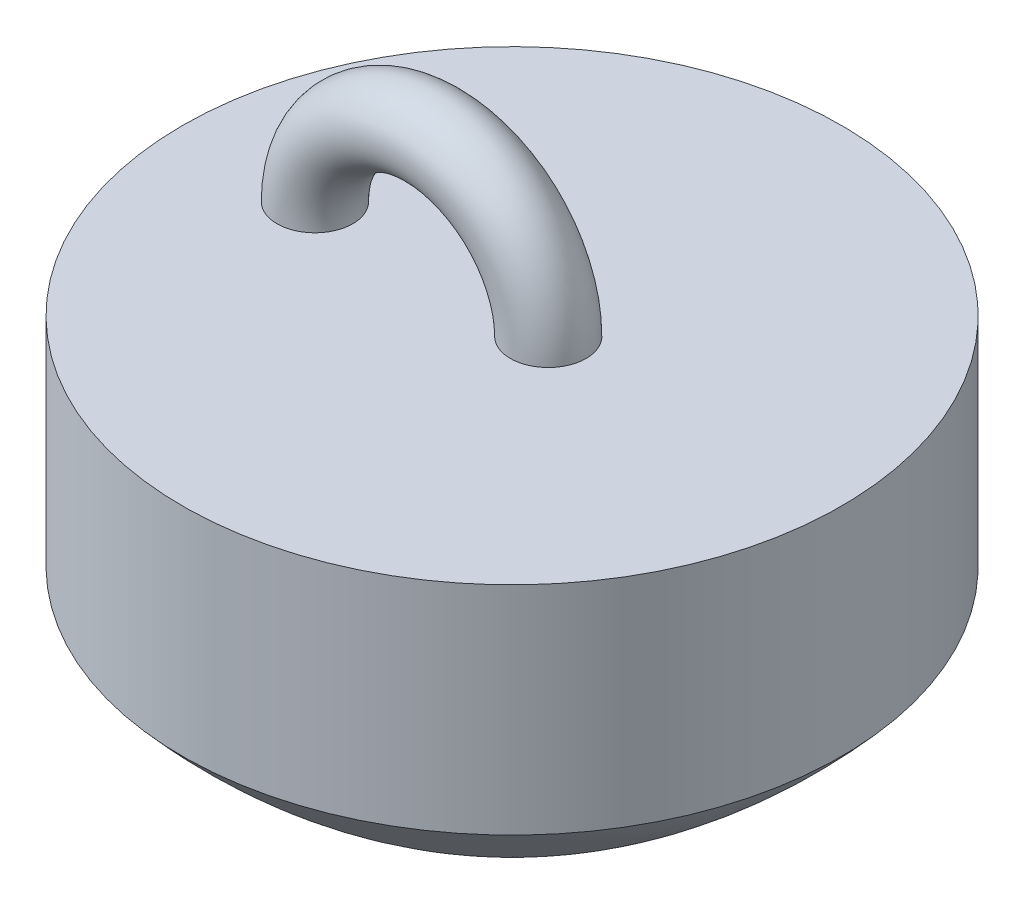
ISO-10303-21;
HEADER;
FILE_DESCRIPTION(('STEP AP214'),'2;1');
FILE_NAME('part.step','',(''),(''),'','','');
FILE_SCHEMA(('AUTOMOTIVE_DESIGN { 1 0 10303 214 1 1 1 1 }'));
ENDSEC;
DATA;
#1=APPLICATION_CONTEXT('core data for automotive mechanical design processes');
#2=APPLICATION_PROTOCOL_DEFINITION('international standard','automotive_design',2000,#1);
#3=PRODUCT_CONTEXT('',#1,'mechanical');
#4=PRODUCT('Part','Part','',(#3));
#5=PRODUCT_RELATED_PRODUCT_CATEGORY('part','',(#4));
#6=PRODUCT_DEFINITION_FORMATION('','',#4);
#7=PRODUCT_DEFINITION_CONTEXT('part definition',#1,'design');
#8=PRODUCT_DEFINITION('design','',#6,#7);
#9=PRODUCT_DEFINITION_SHAPE('','',#8);
#10=(LENGTH_UNIT() NAMED_UNIT(*) SI_UNIT(.MILLI.,.METRE.));
#11=(NAMED_UNIT(*) PLANE_ANGLE_UNIT() SI_UNIT($,.RADIAN.));
#12=(NAMED_UNIT(*) SI_UNIT($,.STERADIAN.) SOLID_ANGLE_UNIT());
#13=UNCERTAINTY_MEASURE_WITH_UNIT(LENGTH_MEASURE(1.E-05),#10,'distance_accuracy_value','');
#14=(GEOMETRIC_REPRESENTATION_CONTEXT(3) GLOBAL_UNCERTAINTY_ASSIGNED_CONTEXT((#13)) GLOBAL_UNIT_ASSIGNED_CONTEXT((#10,
#11,#12)) REPRESENTATION_CONTEXT('',''));
#15=CARTESIAN_POINT('',(0.,0.,0.));
#16=DIRECTION('',(0.,0.,1.));
#17=DIRECTION('',(1.,0.,0.));
#18=AXIS2_PLACEMENT_3D('',#15,#16,#17);
#19=CARTESIAN_POINT('',(14.605,-9.08621613082581,0.));
#20=DIRECTION('',(0.,1.,0.));
#21=DIRECTION('',(-1.,0.,0.));
#22=AXIS2_PLACEMENT_3D('',#19,#20,#21);
#23=CYLINDRICAL_SURFACE('',#22,14.351);
#24=CARTESIAN_POINT('',(14.605,-18.5247713191279,0.));
#25=DIRECTION('',(0.,1.,0.));
#26=DIRECTION('',(-1.,0.,0.));
#27=AXIS2_PLACEMENT_3D('',#24,#25,#26);
#28=CIRCLE('',#27,14.351);
#29=CARTESIAN_POINT('',(0.254000000000001,-18.5247713191279,0.));
#30=VERTEX_POINT('',#29);
#31=EDGE_CURVE('E11',#30,#30,#28,.T.);
#32=ORIENTED_EDGE('',*,*,#31,.T.);
#33=EDGE_LOOP('',(#32));
#34=FACE_BOUND('',#33,.T.);
#35=CARTESIAN_POINT('',(14.605,-9.08621613082581,0.));
#36=DIRECTION('',(0.,1.,0.));
#37=DIRECTION('',(-1.,0.,0.));
#38=AXIS2_PLACEMENT_3D('',#35,#36,#37);
#39=CIRCLE('',#38,14.351);
#40=CARTESIAN_POINT('',(0.254000000000001,-9.08621613082581,0.));
#41=VERTEX_POINT('',#40);
#42=EDGE_CURVE('E54',#41,#41,#39,.T.);
#43=ORIENTED_EDGE('',*,*,#42,.F.);
#44=EDGE_LOOP('',(#43));
#45=FACE_BOUND('',#44,.T.);
#46=ADVANCED_FACE('F47',(#34,#45),#23,.T.);
#47=CARTESIAN_POINT('',(18.9030515195273,-2.18658188447792,0.));
#48=DIRECTION('',(0.,0.,-1.));
#49=DIRECTION('',(-1.,0.,0.));
#50=AXIS2_PLACEMENT_3D('',#47,#48,#49);
#51=CIRCLE('',#50,24.7936192715079);
#52=TRIMMED_CURVE('',#51,(PARAMETER_VALUE(-1.3965629923342)),(PARAMETER_VALUE(1.3965629923342)),
.T.,.PARAMETER.);
#53=CARTESIAN_POINT('',(14.605,-2.18658188447792,0.));
#54=DIRECTION('',(0.,1.,0.));
#55=AXIS1_PLACEMENT('',#53,#54);
#56=SURFACE_OF_REVOLUTION('',#52,#55);
#57=CARTESIAN_POINT('',(14.605,-26.6048191205271,0.));
#58=VERTEX_POINT('',#57);
#59=VERTEX_LOOP('',#58);
#60=FACE_BOUND('',#59,.T.);
#61=ORIENTED_EDGE('',*,*,#31,.F.);
#62=EDGE_LOOP('',(#61));
#63=FACE_BOUND('',#62,.T.);
#64=ADVANCED_FACE('F57',(#60,#63),#56,.T.);
#65=CARTESIAN_POINT('',(0.,-9.08621613082581,0.));
#66=DIRECTION('',(0.,-1.,0.));
#67=DIRECTION('',(1.,0.,0.));
#68=AXIS2_PLACEMENT_3D('',#65,#66,#67);
#69=PLANE('',#68);
#70=CARTESIAN_POINT('',(6.01961955505702,-9.08621613082581,0.));
#71=DIRECTION('',(0.,1.,0.));
#72=DIRECTION('',(-1.,0.,0.));
#73=AXIS2_PLACEMENT_3D('',#70,#71,#72);
#74=CIRCLE('',#73,1.651);
#75=CARTESIAN_POINT('',(4.36861955505702,-9.08621613082581,0.));
#76=VERTEX_POINT('',#75);
#77=EDGE_CURVE('E72',#76,#76,#74,.T.);
#78=ORIENTED_EDGE('',*,*,#77,.F.);
#79=EDGE_LOOP('',(#78));
#80=FACE_BOUND('',#79,.T.);
#81=CARTESIAN_POINT('',(16.179619555057,-9.08621613082581,0.));
#82=DIRECTION('',(0.,-1.,0.));
#83=DIRECTION('',(1.,0.,0.));
#84=AXIS2_PLACEMENT_3D('',#81,#82,#83);
#85=CIRCLE('',#84,1.651);
#86=CARTESIAN_POINT('',(17.830619555057,-9.0862161308258,0.));
#87=VERTEX_POINT('',#86);
#88=EDGE_CURVE('E69',#87,#87,#85,.T.);
#89=ORIENTED_EDGE('',*,*,#88,.T.);
#90=EDGE_LOOP('',(#89));
#91=FACE_BOUND('',#90,.T.);
#92=ORIENTED_EDGE('',*,*,#42,.T.);
#93=EDGE_LOOP('',(#92));
#94=FACE_BOUND('',#93,.T.);
#95=ADVANCED_FACE('F60',(#80,#91,#94),#69,.F.);
#96=CARTESIAN_POINT('',(11.099619555057,-9.08621613082581,0.));
#97=DIRECTION('',(0.,0.,-1.));
#98=DIRECTION('',(-1.,0.,0.));
#99=AXIS2_PLACEMENT_3D('',#96,#97,#98);
#100=TOROIDAL_SURFACE('',#99,5.08,1.651);
#101=CARTESIAN_POINT('',(11.099619555057,-9.08621613082581,0.));
#102=DIRECTION('',(0.,0.,-1.));
#103=DIRECTION('',(-1.,0.,0.));
#104=AXIS2_PLACEMENT_3D('',#101,#102,#103);
#105=CIRCLE('',#104,6.731);
#106=EDGE_CURVE('',#76,#87,#105,.T.);
#107=ORIENTED_EDGE('',*,*,#77,.T.);
#108=ORIENTED_EDGE('',*,*,#88,.F.);
#109=ORIENTED_EDGE('',*,*,#106,.T.);
#110=ORIENTED_EDGE('',*,*,#106,.F.);
#111=EDGE_LOOP('',(#107,#109,#108,#110));
#112=FACE_BOUND('',#111,.T.);
#113=ADVANCED_FACE('F79',(#112),#100,.T.);
#114=CLOSED_SHELL('',(#46,#64,#95,#113));
#115=MANIFOLD_SOLID_BREP('B2',#114);
#116=ADVANCED_BREP_SHAPE_REPRESENTATION('',(#18,#115),#14);
#117=SHAPE_DEFINITION_REPRESENTATION(#9,#116);
ENDSEC;
END-ISO-10303-21;
